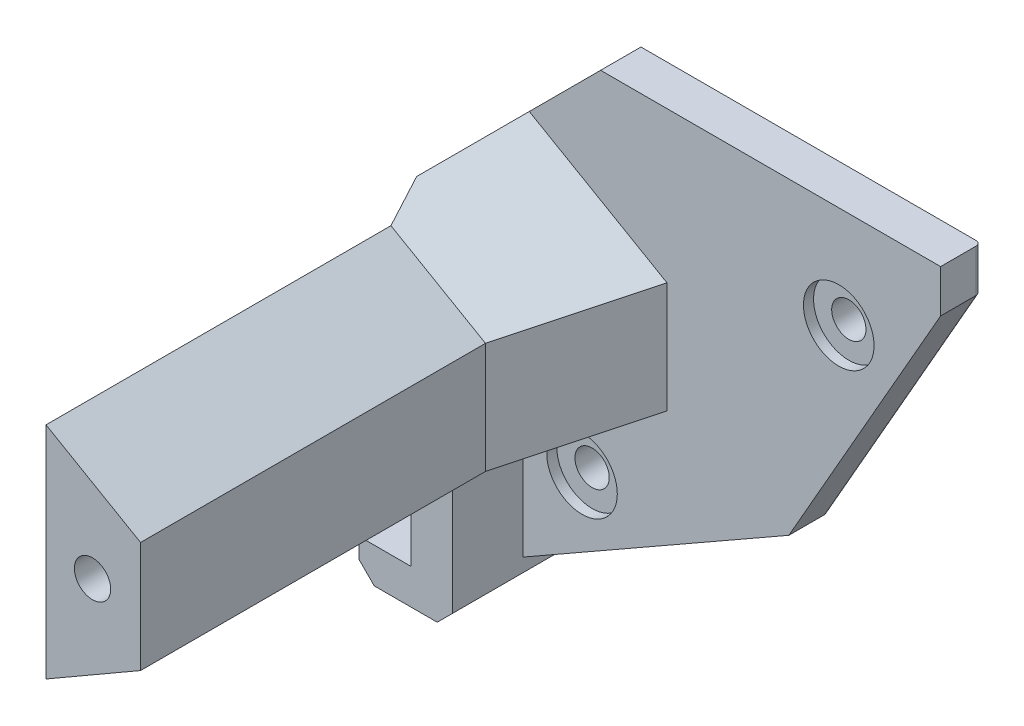
ISO-10303-21;
HEADER;
FILE_DESCRIPTION(('STEP AP214'),'2;1');
FILE_NAME('part.step','',(''),(''),'','','');
FILE_SCHEMA(('AUTOMOTIVE_DESIGN { 1 0 10303 214 1 1 1 1 }'));
ENDSEC;
DATA;
#1=APPLICATION_CONTEXT('core data for automotive mechanical design processes');
#2=APPLICATION_PROTOCOL_DEFINITION('international standard','automotive_design',2000,#1);
#3=PRODUCT_CONTEXT('',#1,'mechanical');
#4=PRODUCT('Part','Part','',(#3));
#5=PRODUCT_RELATED_PRODUCT_CATEGORY('part','',(#4));
#6=PRODUCT_DEFINITION_FORMATION('','',#4);
#7=PRODUCT_DEFINITION_CONTEXT('part definition',#1,'design');
#8=PRODUCT_DEFINITION('design','',#6,#7);
#9=PRODUCT_DEFINITION_SHAPE('','',#8);
#10=(LENGTH_UNIT() NAMED_UNIT(*) SI_UNIT(.MILLI.,.METRE.));
#11=(NAMED_UNIT(*) PLANE_ANGLE_UNIT() SI_UNIT($,.RADIAN.));
#12=(NAMED_UNIT(*) SI_UNIT($,.STERADIAN.) SOLID_ANGLE_UNIT());
#13=UNCERTAINTY_MEASURE_WITH_UNIT(LENGTH_MEASURE(1.E-05),#10,'distance_accuracy_value','');
#14=(GEOMETRIC_REPRESENTATION_CONTEXT(3) GLOBAL_UNCERTAINTY_ASSIGNED_CONTEXT((#13)) GLOBAL_UNIT_ASSIGNED_CONTEXT((#10,
#11,#12)) REPRESENTATION_CONTEXT('',''));
#15=CARTESIAN_POINT('',(0.,0.,0.));
#16=DIRECTION('',(0.,0.,1.));
#17=DIRECTION('',(1.,0.,0.));
#18=AXIS2_PLACEMENT_3D('',#15,#16,#17);
#19=CARTESIAN_POINT('',(35.1478751443918,-60.6037192671102,4.));
#20=DIRECTION('',(0.,0.,-1.));
#21=DIRECTION('',(-1.,0.,0.));
#22=AXIS2_PLACEMENT_3D('',#19,#20,#21);
#23=CYLINDRICAL_SURFACE('',#22,1.70000000000199);
#24=CARTESIAN_POINT('',(35.1478751443918,-60.6037192671102,0.));
#25=DIRECTION('',(0.,0.,1.));
#26=DIRECTION('',(1.,0.,0.));
#27=AXIS2_PLACEMENT_3D('',#24,#25,#26);
#28=CIRCLE('',#27,1.70000000000199);
#29=CARTESIAN_POINT('',(36.8478751443938,-60.6037192671102,0.));
#30=VERTEX_POINT('',#29);
#31=EDGE_CURVE('E208',#30,#30,#28,.T.);
#32=ORIENTED_EDGE('',*,*,#31,.F.);
#33=EDGE_LOOP('',(#32));
#34=FACE_BOUND('',#33,.T.);
#35=CARTESIAN_POINT('',(35.1478751443918,-60.6037192671102,3.));
#36=DIRECTION('',(0.,0.,1.));
#37=DIRECTION('',(1.,0.,0.));
#38=AXIS2_PLACEMENT_3D('',#35,#36,#37);
#39=CIRCLE('',#38,1.70000000000199);
#40=CARTESIAN_POINT('',(36.8478751443938,-60.6037192671102,3.));
#41=VERTEX_POINT('',#40);
#42=EDGE_CURVE('E262',#41,#41,#39,.T.);
#43=ORIENTED_EDGE('',*,*,#42,.T.);
#44=EDGE_LOOP('',(#43));
#45=FACE_BOUND('',#44,.T.);
#46=ADVANCED_FACE('F38',(#34,#45),#23,.F.);
#47=CARTESIAN_POINT('',(60.6037192671076,-35.1478751443945,4.));
#48=DIRECTION('',(0.,0.,-1.));
#49=DIRECTION('',(-1.,0.,0.));
#50=AXIS2_PLACEMENT_3D('',#47,#48,#49);
#51=CYLINDRICAL_SURFACE('',#50,1.70000000000218);
#52=CARTESIAN_POINT('',(60.6037192671076,-35.1478751443945,0.));
#53=DIRECTION('',(0.,0.,1.));
#54=DIRECTION('',(1.,0.,0.));
#55=AXIS2_PLACEMENT_3D('',#52,#53,#54);
#56=CIRCLE('',#55,1.70000000000218);
#57=CARTESIAN_POINT('',(62.3037192671097,-35.1478751443945,0.));
#58=VERTEX_POINT('',#57);
#59=EDGE_CURVE('E294',#58,#58,#56,.T.);
#60=ORIENTED_EDGE('',*,*,#59,.F.);
#61=EDGE_LOOP('',(#60));
#62=FACE_BOUND('',#61,.T.);
#63=CARTESIAN_POINT('',(60.6037192671076,-35.1478751443945,3.));
#64=DIRECTION('',(0.,0.,1.));
#65=DIRECTION('',(1.,0.,0.));
#66=AXIS2_PLACEMENT_3D('',#63,#64,#65);
#67=CIRCLE('',#66,1.70000000000218);
#68=CARTESIAN_POINT('',(62.3037192671097,-35.1478751443945,3.));
#69=VERTEX_POINT('',#68);
#70=EDGE_CURVE('E259',#69,#69,#67,.T.);
#71=ORIENTED_EDGE('',*,*,#70,.T.);
#72=EDGE_LOOP('',(#71));
#73=FACE_BOUND('',#72,.T.);
#74=ADVANCED_FACE('F321',(#62,#73),#51,.F.);
#75=CARTESIAN_POINT('',(31.021837567298,-31.0218375672957,4.));
#76=DIRECTION('',(-0.707106781186574,0.707106781186521,0.));
#77=DIRECTION('',(-0.707106781186521,-0.707106781186574,0.));
#78=AXIS2_PLACEMENT_3D('',#75,#76,#77);
#79=PLANE('',#78);
#80=DIRECTION('',(0.707106781186521,0.707106781186574,0.));
#81=VECTOR('',#80,1.);
#82=CARTESIAN_POINT('',(31.021837567298,-31.0218375672957,0.));
#83=LINE('',#82,#81);
#84=CARTESIAN_POINT('',(25.2,-36.8436751345942,0.));
#85=VERTEX_POINT('',#84);
#86=CARTESIAN_POINT('',(36.9936751345955,-25.0499999999978,0.));
#87=VERTEX_POINT('',#86);
#88=EDGE_CURVE('E191',#85,#87,#83,.T.);
#89=ORIENTED_EDGE('',*,*,#88,.F.);
#90=DIRECTION('',(0.,0.,-1.));
#91=VECTOR('',#90,1.);
#92=CARTESIAN_POINT('',(25.2,-36.8436751345942,80.4066636545569));
#93=LINE('',#92,#91);
#94=CARTESIAN_POINT('',(25.2,-36.8436751345942,10.447019978079));
#95=VERTEX_POINT('',#94);
#96=EDGE_CURVE('E54',#95,#85,#93,.T.);
#97=ORIENTED_EDGE('',*,*,#96,.F.);
#98=DIRECTION('',(0.508589802709456,0.508589802709494,-0.694746590606873));
#99=VECTOR('',#98,1.);
#100=CARTESIAN_POINT('',(24.5604591975379,-37.4832159370563,11.320648960999));
#101=LINE('',#100,#99);
#102=CARTESIAN_POINT('',(29.9195461813652,-32.1241289532286,4.));
#103=VERTEX_POINT('',#102);
#104=EDGE_CURVE('E11',#95,#103,#101,.T.);
#105=ORIENTED_EDGE('',*,*,#104,.T.);
#106=DIRECTION('',(0.707106781186521,0.707106781186574,0.));
#107=VECTOR('',#106,1.);
#108=CARTESIAN_POINT('',(31.021837567298,-31.0218375672957,4.));
#109=LINE('',#108,#107);
#110=CARTESIAN_POINT('',(36.9936751345955,-25.0499999999978,4.));
#111=VERTEX_POINT('',#110);
#112=EDGE_CURVE('E214',#103,#111,#109,.T.);
#113=ORIENTED_EDGE('',*,*,#112,.T.);
#114=DIRECTION('',(0.,0.,-1.));
#115=VECTOR('',#114,1.);
#116=CARTESIAN_POINT('',(36.9936751345955,-25.0499999999978,4.));
#117=LINE('',#116,#115);
#118=EDGE_CURVE('E201',#111,#87,#117,.T.);
#119=ORIENTED_EDGE('',*,*,#118,.T.);
#120=EDGE_LOOP('',(#89,#97,#105,#113,#119));
#121=FACE_BOUND('',#120,.T.);
#122=ADVANCED_FACE('F199',(#121),#79,.T.);
#123=CARTESIAN_POINT('',(0.,0.,4.));
#124=DIRECTION('',(0.,0.,1.));
#125=DIRECTION('',(1.,0.,0.));
#126=AXIS2_PLACEMENT_3D('',#123,#124,#125);
#127=PLANE('',#126);
#128=CARTESIAN_POINT('',(60.6037192671076,-35.1478751443945,4.));
#129=DIRECTION('',(0.,0.,1.));
#130=DIRECTION('',(1.,0.,0.));
#131=AXIS2_PLACEMENT_3D('',#128,#129,#130);
#132=CIRCLE('',#131,3.50000000000001);
#133=CARTESIAN_POINT('',(64.1037192671076,-35.1478751443945,4.));
#134=VERTEX_POINT('',#133);
#135=EDGE_CURVE('E334',#134,#134,#132,.T.);
#136=ORIENTED_EDGE('',*,*,#135,.F.);
#137=EDGE_LOOP('',(#136));
#138=FACE_BOUND('',#137,.T.);
#139=CARTESIAN_POINT('',(35.1478751443918,-60.6037192671102,4.));
#140=DIRECTION('',(0.,0.,1.));
#141=DIRECTION('',(1.,0.,0.));
#142=AXIS2_PLACEMENT_3D('',#139,#140,#141);
#143=CIRCLE('',#142,3.5);
#144=CARTESIAN_POINT('',(38.6478751443919,-60.6037192671102,4.));
#145=VERTEX_POINT('',#144);
#146=EDGE_CURVE('E301',#145,#145,#143,.T.);
#147=ORIENTED_EDGE('',*,*,#146,.F.);
#148=EDGE_LOOP('',(#147));
#149=FACE_BOUND('',#148,.T.);
#150=DIRECTION('',(0.,-1.,0.));
#151=VECTOR('',#150,1.);
#152=CARTESIAN_POINT('',(43.5762794416288,0.,4.));
#153=LINE('',#152,#151);
#154=CARTESIAN_POINT('',(43.5762794416288,-40.0088475772927,4.));
#155=VERTEX_POINT('',#154);
#156=CARTESIAN_POINT('',(43.5762794416288,-51.0088475772927,4.));
#157=VERTEX_POINT('',#156);
#158=EDGE_CURVE('E270',#155,#157,#153,.T.);
#159=ORIENTED_EDGE('',*,*,#158,.T.);
#160=DIRECTION('',(0.866025403784439,0.5,0.));
#161=VECTOR('',#160,1.);
#162=CARTESIAN_POINT('',(25.05,-61.7049999999994,4.));
#163=LINE('',#162,#161);
#164=CARTESIAN_POINT('',(29.2892350986244,-59.2574764746505,4.));
#165=VERTEX_POINT('',#164);
#166=EDGE_CURVE('E286',#165,#157,#163,.T.);
#167=ORIENTED_EDGE('',*,*,#166,.F.);
#168=DIRECTION('',(0.,1.,0.));
#169=VECTOR('',#168,1.);
#170=CARTESIAN_POINT('',(29.2892350986243,0.,4.));
#171=LINE('',#170,#169);
#172=CARTESIAN_POINT('',(29.2892350986244,-70.7049999999994,4.));
#173=VERTEX_POINT('',#172);
#174=EDGE_CURVE('E385',#173,#165,#171,.T.);
#175=ORIENTED_EDGE('',*,*,#174,.F.);
#176=DIRECTION('',(-0.868449319732085,-0.495777953379212,0.));
#177=VECTOR('',#176,1.);
#178=CARTESIAN_POINT('',(37.6417756121471,-65.9367246991577,4.));
#179=LINE('',#178,#177);
#180=CARTESIAN_POINT('',(55.653971798805,-55.6539717988031,4.));
#181=VERTEX_POINT('',#180);
#182=EDGE_CURVE('E202',#181,#173,#179,.T.);
#183=ORIENTED_EDGE('',*,*,#182,.F.);
#184=DIRECTION('',(-0.495777953379193,-0.868449319732095,0.));
#185=VECTOR('',#184,1.);
#186=CARTESIAN_POINT('',(65.9367246991587,-37.6417756121458,4.));
#187=LINE('',#186,#185);
#188=CARTESIAN_POINT('',(70.7050000000007,-29.2892350986222,4.));
#189=VERTEX_POINT('',#188);
#190=EDGE_CURVE('E206',#189,#181,#187,.T.);
#191=ORIENTED_EDGE('',*,*,#190,.F.);
#192=DIRECTION('',(0.,1.,0.));
#193=VECTOR('',#192,1.);
#194=CARTESIAN_POINT('',(70.7050000000007,0.,4.));
#195=LINE('',#194,#193);
#196=CARTESIAN_POINT('',(70.7050000000007,-25.0499999999978,4.));
#197=VERTEX_POINT('',#196);
#198=EDGE_CURVE('E309',#189,#197,#195,.T.);
#199=ORIENTED_EDGE('',*,*,#198,.T.);
#200=DIRECTION('',(-1.,0.,0.));
#201=VECTOR('',#200,1.);
#202=CARTESIAN_POINT('',(0.,-25.0499999999978,4.));
#203=LINE('',#202,#201);
#204=EDGE_CURVE('E307',#197,#111,#203,.T.);
#205=ORIENTED_EDGE('',*,*,#204,.T.);
#206=ORIENTED_EDGE('',*,*,#112,.F.);
#207=DIRECTION('',(0.866025403784439,-0.499999999999999,0.));
#208=VECTOR('',#207,1.);
#209=CARTESIAN_POINT('',(-6.43026932863032,-11.1375531835396,4.));
#210=LINE('',#209,#208);
#211=EDGE_CURVE('E268',#103,#155,#210,.T.);
#212=ORIENTED_EDGE('',*,*,#211,.T.);
#213=EDGE_LOOP('',(#159,#167,#175,#183,#191,#199,#205,#206,#212));
#214=FACE_BOUND('',#213,.T.);
#215=ADVANCED_FACE('F305',(#138,#149,#214),#127,.T.);
#216=CARTESIAN_POINT('',(0.,0.,0.));
#217=DIRECTION('',(0.,0.,1.));
#218=DIRECTION('',(1.,0.,0.));
#219=AXIS2_PLACEMENT_3D('',#216,#217,#218);
#220=PLANE('',#219);
#221=ORIENTED_EDGE('',*,*,#31,.T.);
#222=EDGE_LOOP('',(#221));
#223=FACE_BOUND('',#222,.T.);
#224=ORIENTED_EDGE('',*,*,#59,.T.);
#225=EDGE_LOOP('',(#224));
#226=FACE_BOUND('',#225,.T.);
#227=DIRECTION('',(1.,0.,0.));
#228=VECTOR('',#227,1.);
#229=CARTESIAN_POINT('',(25.05,-70.05,0.));
#230=LINE('',#229,#228);
#231=CARTESIAN_POINT('',(20.05,-70.05,0.));
#232=VERTEX_POINT('',#231);
#233=CARTESIAN_POINT('',(25.2,-70.05,0.));
#234=VERTEX_POINT('',#233);
#235=EDGE_CURVE('E194',#232,#234,#230,.T.);
#236=ORIENTED_EDGE('',*,*,#235,.T.);
#237=DIRECTION('',(0.,1.,0.));
#238=VECTOR('',#237,1.);
#239=CARTESIAN_POINT('',(25.2,-70.05,0.));
#240=LINE('',#239,#238);
#241=EDGE_CURVE('E183',#234,#85,#240,.T.);
#242=ORIENTED_EDGE('',*,*,#241,.T.);
#243=ORIENTED_EDGE('',*,*,#88,.T.);
#244=DIRECTION('',(-1.,0.,0.));
#245=VECTOR('',#244,1.);
#246=CARTESIAN_POINT('',(0.,-25.0499999999978,0.));
#247=LINE('',#246,#245);
#248=CARTESIAN_POINT('',(70.2050000000007,-25.0499999999978,0.));
#249=VERTEX_POINT('',#248);
#250=EDGE_CURVE('E203',#249,#87,#247,.T.);
#251=ORIENTED_EDGE('',*,*,#250,.F.);
#252=DIRECTION('',(0.,1.,0.));
#253=VECTOR('',#252,1.);
#254=CARTESIAN_POINT('',(70.2050000000007,0.,0.));
#255=LINE('',#254,#253);
#256=CARTESIAN_POINT('',(70.2050000000007,-29.1565641323446,0.));
#257=VERTEX_POINT('',#256);
#258=EDGE_CURVE('E239',#249,#257,#255,.F.);
#259=ORIENTED_EDGE('',*,*,#258,.T.);
#260=DIRECTION('',(-0.495777953379193,-0.868449319732095,0.));
#261=VECTOR('',#260,1.);
#262=CARTESIAN_POINT('',(55.219747138939,-55.4060828221135,0.));
#263=LINE('',#262,#261);
#264=CARTESIAN_POINT('',(55.2874639523084,-55.2874639523064,0.));
#265=VERTEX_POINT('',#264);
#266=EDGE_CURVE('E237',#257,#265,#263,.T.);
#267=ORIENTED_EDGE('',*,*,#266,.T.);
#268=DIRECTION('',(-0.868449319732085,-0.495777953379212,0.));
#269=VECTOR('',#268,1.);
#270=CARTESIAN_POINT('',(29.0413461219348,-70.2707753401333,0.));
#271=LINE('',#270,#269);
#272=CARTESIAN_POINT('',(29.2892350986244,-70.1292611645377,0.));
#273=VERTEX_POINT('',#272);
#274=EDGE_CURVE('E234',#265,#273,#271,.T.);
#275=ORIENTED_EDGE('',*,*,#274,.T.);
#276=DIRECTION('',(0.,-1.,0.));
#277=VECTOR('',#276,1.);
#278=CARTESIAN_POINT('',(29.2892350986244,-59.2574764746505,0.));
#279=LINE('',#278,#277);
#280=CARTESIAN_POINT('',(29.2892350986244,-72.05,0.));
#281=VERTEX_POINT('',#280);
#282=EDGE_CURVE('E383',#273,#281,#279,.T.);
#283=ORIENTED_EDGE('',*,*,#282,.T.);
#284=DIRECTION('',(-0.707106781186541,-0.707106781186554,0.));
#285=VECTOR('',#284,1.);
#286=CARTESIAN_POINT('',(29.2892350986244,-72.05,0.));
#287=LINE('',#286,#285);
#288=CARTESIAN_POINT('',(27.7892350986244,-73.55,0.));
#289=VERTEX_POINT('',#288);
#290=EDGE_CURVE('E381',#281,#289,#287,.T.);
#291=ORIENTED_EDGE('',*,*,#290,.T.);
#292=DIRECTION('',(-1.,0.,0.));
#293=VECTOR('',#292,1.);
#294=CARTESIAN_POINT('',(27.7892350986244,-73.55,0.));
#295=LINE('',#294,#293);
#296=CARTESIAN_POINT('',(21.55,-73.55,0.));
#297=VERTEX_POINT('',#296);
#298=EDGE_CURVE('E379',#289,#297,#295,.T.);
#299=ORIENTED_EDGE('',*,*,#298,.T.);
#300=DIRECTION('',(-0.707106781186554,0.707106781186541,0.));
#301=VECTOR('',#300,1.);
#302=CARTESIAN_POINT('',(20.05,-72.05,0.));
#303=LINE('',#302,#301);
#304=CARTESIAN_POINT('',(20.05,-72.05,0.));
#305=VERTEX_POINT('',#304);
#306=EDGE_CURVE('E377',#297,#305,#303,.T.);
#307=ORIENTED_EDGE('',*,*,#306,.T.);
#308=DIRECTION('',(0.,1.,0.));
#309=VECTOR('',#308,1.);
#310=CARTESIAN_POINT('',(20.05,-70.05,0.));
#311=LINE('',#310,#309);
#312=EDGE_CURVE('E374',#305,#232,#311,.T.);
#313=ORIENTED_EDGE('',*,*,#312,.T.);
#314=EDGE_LOOP('',(#236,#242,#243,#251,#259,#267,#275,#283,#291,#299,#307,#313));
#315=FACE_BOUND('',#314,.T.);
#316=ADVANCED_FACE('F189',(#223,#226,#315),#220,.F.);
#317=CARTESIAN_POINT('',(25.05,-61.7049999999994,47.2));
#318=DIRECTION('',(-0.5,0.866025403784439,0.));
#319=DIRECTION('',(-0.866025403784439,-0.5,0.));
#320=AXIS2_PLACEMENT_3D('',#317,#318,#319);
#321=PLANE('',#320);
#322=DIRECTION('',(0.,0.,1.));
#323=VECTOR('',#322,1.);
#324=CARTESIAN_POINT('',(25.2,-61.6183974596209,47.2));
#325=LINE('',#324,#323);
#326=CARTESIAN_POINT('',(25.2,-61.6183974596209,11.));
#327=VERTEX_POINT('',#326);
#328=CARTESIAN_POINT('',(25.2,-61.6183974596209,47.2));
#329=VERTEX_POINT('',#328);
#330=EDGE_CURVE('E343',#327,#329,#325,.T.);
#331=ORIENTED_EDGE('',*,*,#330,.F.);
#332=DIRECTION('',(-0.866025403784438,-0.5,0.));
#333=VECTOR('',#332,1.);
#334=CARTESIAN_POINT('',(29.2892350986244,-59.2574764746505,11.));
#335=LINE('',#334,#333);
#336=CARTESIAN_POINT('',(29.2892350986244,-59.2574764746505,11.));
#337=VERTEX_POINT('',#336);
#338=EDGE_CURVE('E350',#337,#327,#335,.T.);
#339=ORIENTED_EDGE('',*,*,#338,.F.);
#340=DIRECTION('',(0.,0.,-1.));
#341=VECTOR('',#340,1.);
#342=CARTESIAN_POINT('',(29.2892350986244,-59.2574764746505,47.2));
#343=LINE('',#342,#341);
#344=EDGE_CURVE('E226',#337,#165,#343,.T.);
#345=ORIENTED_EDGE('',*,*,#344,.T.);
#346=ORIENTED_EDGE('',*,*,#166,.T.);
#347=DIRECTION('',(-0.654653670707974,-0.377964473009225,0.654653670707981));
#348=VECTOR('',#347,1.);
#349=CARTESIAN_POINT('',(14.4755483321267,-67.8101625169787,33.1007311095024));
#350=LINE('',#349,#348);
#351=CARTESIAN_POINT('',(34.5762794416288,-56.2049999999993,13.0000000000001));
#352=VERTEX_POINT('',#351);
#353=EDGE_CURVE('E274',#157,#352,#350,.T.);
#354=ORIENTED_EDGE('',*,*,#353,.T.);
#355=DIRECTION('',(0.,0.,-1.));
#356=VECTOR('',#355,1.);
#357=CARTESIAN_POINT('',(34.5762794416288,-56.2049999999993,47.2));
#358=LINE('',#357,#356);
#359=CARTESIAN_POINT('',(34.5762794416288,-56.2049999999993,47.2));
#360=VERTEX_POINT('',#359);
#361=EDGE_CURVE('E283',#360,#352,#358,.T.);
#362=ORIENTED_EDGE('',*,*,#361,.F.);
#363=DIRECTION('',(0.866025403784439,0.5,0.));
#364=VECTOR('',#363,1.);
#365=CARTESIAN_POINT('',(25.05,-61.7049999999994,47.2));
#366=LINE('',#365,#364);
#367=EDGE_CURVE('E395',#329,#360,#366,.T.);
#368=ORIENTED_EDGE('',*,*,#367,.F.);
#369=EDGE_LOOP('',(#331,#339,#345,#346,#354,#362,#368));
#370=FACE_BOUND('',#369,.T.);
#371=ADVANCED_FACE('F281',(#370),#321,.F.);
#372=CARTESIAN_POINT('',(34.5762794416288,-45.2049999999993,47.2));
#373=DIRECTION('',(-0.499999999999999,-0.866025403784439,0.));
#374=DIRECTION('',(0.866025403784439,-0.499999999999999,0.));
#375=AXIS2_PLACEMENT_3D('',#372,#373,#374);
#376=PLANE('',#375);
#377=DIRECTION('',(0.,0.,-1.));
#378=VECTOR('',#377,1.);
#379=CARTESIAN_POINT('',(34.5762794416288,-45.2049999999993,47.2));
#380=LINE('',#379,#378);
#381=CARTESIAN_POINT('',(34.5762794416288,-45.2049999999993,47.2));
#382=VERTEX_POINT('',#381);
#383=CARTESIAN_POINT('',(34.5762794416288,-45.2049999999993,13.0000000000001));
#384=VERTEX_POINT('',#383);
#385=EDGE_CURVE('E295',#382,#384,#380,.T.);
#386=ORIENTED_EDGE('',*,*,#385,.T.);
#387=DIRECTION('',(-0.866025403784439,0.499999999999999,0.));
#388=VECTOR('',#387,1.);
#389=CARTESIAN_POINT('',(34.5762794416288,-45.2049999999993,13.0000000000001));
#390=LINE('',#389,#388);
#391=CARTESIAN_POINT('',(25.2,-39.7916025403778,13.0000000000001));
#392=VERTEX_POINT('',#391);
#393=EDGE_CURVE('E62',#384,#392,#390,.T.);
#394=ORIENTED_EDGE('',*,*,#393,.T.);
#395=DIRECTION('',(0.,0.,-1.));
#396=VECTOR('',#395,1.);
#397=CARTESIAN_POINT('',(25.2,-39.7916025403778,47.2));
#398=LINE('',#397,#396);
#399=CARTESIAN_POINT('',(25.2,-39.7916025403778,47.2));
#400=VERTEX_POINT('',#399);
#401=EDGE_CURVE('E252',#400,#392,#398,.T.);
#402=ORIENTED_EDGE('',*,*,#401,.F.);
#403=DIRECTION('',(-0.866025403784439,0.499999999999999,0.));
#404=VECTOR('',#403,1.);
#405=CARTESIAN_POINT('',(34.5762794416288,-45.2049999999993,47.2));
#406=LINE('',#405,#404);
#407=EDGE_CURVE('E398',#382,#400,#406,.T.);
#408=ORIENTED_EDGE('',*,*,#407,.F.);
#409=EDGE_LOOP('',(#386,#394,#402,#408));
#410=FACE_BOUND('',#409,.T.);
#411=ADVANCED_FACE('F591',(#410),#376,.F.);
#412=CARTESIAN_POINT('',(0.,0.,47.2));
#413=DIRECTION('',(0.,0.,1.));
#414=DIRECTION('',(1.,0.,0.));
#415=AXIS2_PLACEMENT_3D('',#412,#413,#414);
#416=PLANE('',#415);
#417=CARTESIAN_POINT('',(29.8131397208144,-50.7049999999993,47.2));
#418=DIRECTION('',(0.,0.,1.));
#419=DIRECTION('',(1.,0.,0.));
#420=AXIS2_PLACEMENT_3D('',#417,#418,#419);
#421=CIRCLE('',#420,1.8);
#422=CARTESIAN_POINT('',(31.6131397208144,-50.7049999999993,47.2));
#423=VERTEX_POINT('',#422);
#424=EDGE_CURVE('E255',#423,#423,#421,.T.);
#425=ORIENTED_EDGE('',*,*,#424,.F.);
#426=EDGE_LOOP('',(#425));
#427=FACE_BOUND('',#426,.T.);
#428=ORIENTED_EDGE('',*,*,#407,.T.);
#429=DIRECTION('',(0.,1.,0.));
#430=VECTOR('',#429,1.);
#431=CARTESIAN_POINT('',(25.2,-70.05,47.2));
#432=LINE('',#431,#430);
#433=EDGE_CURVE('E186',#329,#400,#432,.T.);
#434=ORIENTED_EDGE('',*,*,#433,.F.);
#435=ORIENTED_EDGE('',*,*,#367,.T.);
#436=DIRECTION('',(0.,1.,0.));
#437=VECTOR('',#436,1.);
#438=CARTESIAN_POINT('',(34.5762794416288,-56.2049999999993,47.2));
#439=LINE('',#438,#437);
#440=EDGE_CURVE('E293',#360,#382,#439,.T.);
#441=ORIENTED_EDGE('',*,*,#440,.T.);
#442=EDGE_LOOP('',(#428,#434,#435,#441));
#443=FACE_BOUND('',#442,.T.);
#444=ADVANCED_FACE('F598',(#427,#443),#416,.T.);
#445=CARTESIAN_POINT('',(0.,0.,11.));
#446=DIRECTION('',(0.,0.,1.));
#447=DIRECTION('',(1.,0.,0.));
#448=AXIS2_PLACEMENT_3D('',#445,#446,#447);
#449=PLANE('',#448);
#450=DIRECTION('',(0.,-1.,0.));
#451=VECTOR('',#450,1.);
#452=CARTESIAN_POINT('',(25.2,0.,11.));
#453=LINE('',#452,#451);
#454=CARTESIAN_POINT('',(25.2,-70.05,11.));
#455=VERTEX_POINT('',#454);
#456=EDGE_CURVE('E247',#327,#455,#453,.T.);
#457=ORIENTED_EDGE('',*,*,#456,.T.);
#458=DIRECTION('',(-1.,0.,0.));
#459=VECTOR('',#458,1.);
#460=CARTESIAN_POINT('',(25.05,-70.05,11.));
#461=LINE('',#460,#459);
#462=CARTESIAN_POINT('',(20.05,-70.05,11.));
#463=VERTEX_POINT('',#462);
#464=EDGE_CURVE('E355',#455,#463,#461,.T.);
#465=ORIENTED_EDGE('',*,*,#464,.T.);
#466=DIRECTION('',(0.,-1.,0.));
#467=VECTOR('',#466,1.);
#468=CARTESIAN_POINT('',(20.05,-70.05,11.));
#469=LINE('',#468,#467);
#470=CARTESIAN_POINT('',(20.05,-72.05,11.));
#471=VERTEX_POINT('',#470);
#472=EDGE_CURVE('E358',#463,#471,#469,.T.);
#473=ORIENTED_EDGE('',*,*,#472,.T.);
#474=DIRECTION('',(0.707106781186554,-0.707106781186541,0.));
#475=VECTOR('',#474,1.);
#476=CARTESIAN_POINT('',(20.05,-72.05,11.));
#477=LINE('',#476,#475);
#478=CARTESIAN_POINT('',(21.55,-73.55,11.));
#479=VERTEX_POINT('',#478);
#480=EDGE_CURVE('E361',#471,#479,#477,.T.);
#481=ORIENTED_EDGE('',*,*,#480,.T.);
#482=DIRECTION('',(1.,0.,0.));
#483=VECTOR('',#482,1.);
#484=CARTESIAN_POINT('',(27.7892350986244,-73.55,11.));
#485=LINE('',#484,#483);
#486=CARTESIAN_POINT('',(27.7892350986244,-73.55,11.));
#487=VERTEX_POINT('',#486);
#488=EDGE_CURVE('E364',#479,#487,#485,.T.);
#489=ORIENTED_EDGE('',*,*,#488,.T.);
#490=DIRECTION('',(0.707106781186541,0.707106781186554,0.));
#491=VECTOR('',#490,1.);
#492=CARTESIAN_POINT('',(29.2892350986244,-72.05,11.));
#493=LINE('',#492,#491);
#494=CARTESIAN_POINT('',(29.2892350986244,-72.05,11.));
#495=VERTEX_POINT('',#494);
#496=EDGE_CURVE('E367',#487,#495,#493,.T.);
#497=ORIENTED_EDGE('',*,*,#496,.T.);
#498=DIRECTION('',(0.,1.,0.));
#499=VECTOR('',#498,1.);
#500=CARTESIAN_POINT('',(29.2892350986244,-59.2574764746505,11.));
#501=LINE('',#500,#499);
#502=EDGE_CURVE('E370',#495,#337,#501,.T.);
#503=ORIENTED_EDGE('',*,*,#502,.T.);
#504=ORIENTED_EDGE('',*,*,#338,.T.);
#505=EDGE_LOOP('',(#457,#465,#473,#481,#489,#497,#503,#504));
#506=FACE_BOUND('',#505,.T.);
#507=ADVANCED_FACE('F442',(#506),#449,.T.);
#508=CARTESIAN_POINT('',(37.6417756121471,-65.9367246991577,4.));
#509=DIRECTION('',(0.495777953379212,-0.868449319732085,0.));
#510=DIRECTION('',(0.868449319732085,0.495777953379212,0.));
#511=AXIS2_PLACEMENT_3D('',#508,#509,#510);
#512=PLANE('',#511);
#513=DIRECTION('',(0.,0.,-1.));
#514=VECTOR('',#513,1.);
#515=CARTESIAN_POINT('',(29.2892350986244,-70.7049999999994,4.));
#516=LINE('',#515,#514);
#517=CARTESIAN_POINT('',(29.2892350986244,-70.7049999999994,0.5));
#518=VERTEX_POINT('',#517);
#519=EDGE_CURVE('E223',#173,#518,#516,.T.);
#520=ORIENTED_EDGE('',*,*,#519,.T.);
#521=DIRECTION('',(-0.868449319732085,-0.495777953379212,0.));
#522=VECTOR('',#521,1.);
#523=CARTESIAN_POINT('',(55.653971798805,-55.6539717988031,0.5));
#524=LINE('',#523,#522);
#525=CARTESIAN_POINT('',(55.653971798805,-55.6539717988031,0.5));
#526=VERTEX_POINT('',#525);
#527=EDGE_CURVE('E243',#518,#526,#524,.F.);
#528=ORIENTED_EDGE('',*,*,#527,.T.);
#529=DIRECTION('',(0.,0.,-1.));
#530=VECTOR('',#529,1.);
#531=CARTESIAN_POINT('',(55.653971798805,-55.6539717988031,4.));
#532=LINE('',#531,#530);
#533=EDGE_CURVE('E220',#181,#526,#532,.T.);
#534=ORIENTED_EDGE('',*,*,#533,.F.);
#535=ORIENTED_EDGE('',*,*,#182,.T.);
#536=EDGE_LOOP('',(#520,#528,#534,#535));
#537=FACE_BOUND('',#536,.T.);
#538=ADVANCED_FACE('F432',(#537),#512,.T.);
#539=CARTESIAN_POINT('',(65.9367246991587,-37.6417756121458,4.));
#540=DIRECTION('',(0.868449319732095,-0.495777953379193,0.));
#541=DIRECTION('',(0.495777953379193,0.868449319732095,0.));
#542=AXIS2_PLACEMENT_3D('',#539,#540,#541);
#543=PLANE('',#542);
#544=ORIENTED_EDGE('',*,*,#533,.T.);
#545=DIRECTION('',(-0.495777953379193,-0.868449319732095,0.));
#546=VECTOR('',#545,1.);
#547=CARTESIAN_POINT('',(70.7050000000007,-29.2892350986222,0.5));
#548=LINE('',#547,#546);
#549=CARTESIAN_POINT('',(70.7050000000007,-29.2892350986222,0.5));
#550=VERTEX_POINT('',#549);
#551=EDGE_CURVE('E241',#526,#550,#548,.F.);
#552=ORIENTED_EDGE('',*,*,#551,.T.);
#553=DIRECTION('',(0.,0.,-1.));
#554=VECTOR('',#553,1.);
#555=CARTESIAN_POINT('',(70.7050000000007,-29.2892350986222,4.));
#556=LINE('',#555,#554);
#557=EDGE_CURVE('E217',#189,#550,#556,.T.);
#558=ORIENTED_EDGE('',*,*,#557,.F.);
#559=ORIENTED_EDGE('',*,*,#190,.T.);
#560=EDGE_LOOP('',(#544,#552,#558,#559));
#561=FACE_BOUND('',#560,.T.);
#562=ADVANCED_FACE('F434',(#561),#543,.T.);
#563=CARTESIAN_POINT('',(70.7050000000007,0.,4.));
#564=DIRECTION('',(-1.,0.,0.));
#565=DIRECTION('',(0.,0.,1.));
#566=AXIS2_PLACEMENT_3D('',#563,#564,#565);
#567=PLANE('',#566);
#568=ORIENTED_EDGE('',*,*,#557,.T.);
#569=DIRECTION('',(0.,1.,0.));
#570=VECTOR('',#569,1.);
#571=CARTESIAN_POINT('',(70.7050000000007,0.,0.5));
#572=LINE('',#571,#570);
#573=CARTESIAN_POINT('',(70.7050000000007,-25.0499999999978,0.5));
#574=VERTEX_POINT('',#573);
#575=EDGE_CURVE('E229',#550,#574,#572,.T.);
#576=ORIENTED_EDGE('',*,*,#575,.T.);
#577=DIRECTION('',(0.,0.,-1.));
#578=VECTOR('',#577,1.);
#579=CARTESIAN_POINT('',(70.7050000000007,-25.0499999999978,4.));
#580=LINE('',#579,#578);
#581=EDGE_CURVE('E213',#197,#574,#580,.T.);
#582=ORIENTED_EDGE('',*,*,#581,.F.);
#583=ORIENTED_EDGE('',*,*,#198,.F.);
#584=EDGE_LOOP('',(#568,#576,#582,#583));
#585=FACE_BOUND('',#584,.T.);
#586=ADVANCED_FACE('F409',(#585),#567,.F.);
#587=CARTESIAN_POINT('',(0.,-25.0499999999978,4.));
#588=DIRECTION('',(0.,-1.,0.));
#589=DIRECTION('',(1.,0.,0.));
#590=AXIS2_PLACEMENT_3D('',#587,#588,#589);
#591=PLANE('',#590);
#592=ORIENTED_EDGE('',*,*,#581,.T.);
#593=CARTESIAN_POINT('',(70.2050000000007,-25.0499999999978,0.5));
#594=DIRECTION('',(0.,-1.,0.));
#595=DIRECTION('',(1.,0.,0.));
#596=AXIS2_PLACEMENT_3D('',#593,#594,#595);
#597=CIRCLE('',#596,0.5);
#598=EDGE_CURVE('E232',#574,#249,#597,.F.);
#599=ORIENTED_EDGE('',*,*,#598,.T.);
#600=ORIENTED_EDGE('',*,*,#250,.T.);
#601=ORIENTED_EDGE('',*,*,#118,.F.);
#602=ORIENTED_EDGE('',*,*,#204,.F.);
#603=EDGE_LOOP('',(#592,#599,#600,#601,#602));
#604=FACE_BOUND('',#603,.T.);
#605=ADVANCED_FACE('F412',(#604),#591,.F.);
#606=CARTESIAN_POINT('',(34.5762794416288,-56.2049999999993,47.2));
#607=DIRECTION('',(-1.,0.,0.));
#608=DIRECTION('',(0.,0.,1.));
#609=AXIS2_PLACEMENT_3D('',#606,#607,#608);
#610=PLANE('',#609);
#611=ORIENTED_EDGE('',*,*,#361,.T.);
#612=DIRECTION('',(0.,1.,0.));
#613=VECTOR('',#612,1.);
#614=CARTESIAN_POINT('',(34.5762794416288,-56.2049999999993,13.0000000000001));
#615=LINE('',#614,#613);
#616=EDGE_CURVE('E258',#352,#384,#615,.T.);
#617=ORIENTED_EDGE('',*,*,#616,.T.);
#618=ORIENTED_EDGE('',*,*,#385,.F.);
#619=ORIENTED_EDGE('',*,*,#440,.F.);
#620=EDGE_LOOP('',(#611,#617,#618,#619));
#621=FACE_BOUND('',#620,.T.);
#622=ADVANCED_FACE('F291',(#621),#610,.F.);
#623=CARTESIAN_POINT('',(29.2892350986244,-59.2574764746505,-17.0188041275033));
#624=DIRECTION('',(1.,0.,0.));
#625=DIRECTION('',(0.,1.,0.));
#626=AXIS2_PLACEMENT_3D('',#623,#624,#625);
#627=PLANE('',#626);
#628=ORIENTED_EDGE('',*,*,#282,.F.);
#629=CARTESIAN_POINT('',(29.2892350986244,-70.1292611645377,0.5));
#630=DIRECTION('',(1.,0.,0.));
#631=DIRECTION('',(0.,1.,0.));
#632=AXIS2_PLACEMENT_3D('',#629,#630,#631);
#633=ELLIPSE('',#632,0.575738835461636,0.5);
#634=EDGE_CURVE('E245',#273,#518,#633,.F.);
#635=ORIENTED_EDGE('',*,*,#634,.T.);
#636=ORIENTED_EDGE('',*,*,#519,.F.);
#637=ORIENTED_EDGE('',*,*,#174,.T.);
#638=ORIENTED_EDGE('',*,*,#344,.F.);
#639=ORIENTED_EDGE('',*,*,#502,.F.);
#640=DIRECTION('',(0.,0.,1.));
#641=VECTOR('',#640,1.);
#642=CARTESIAN_POINT('',(29.2892350986244,-72.05,-17.0188041275033));
#643=LINE('',#642,#641);
#644=EDGE_CURVE('E375',#281,#495,#643,.T.);
#645=ORIENTED_EDGE('',*,*,#644,.F.);
#646=EDGE_LOOP('',(#628,#635,#636,#637,#638,#639,#645));
#647=FACE_BOUND('',#646,.T.);
#648=ADVANCED_FACE('F428',(#647),#627,.T.);
#649=CARTESIAN_POINT('',(29.2892350986244,-72.05,-17.0188041275033));
#650=DIRECTION('',(0.707106781186554,-0.707106781186541,0.));
#651=DIRECTION('',(0.707106781186541,0.707106781186554,0.));
#652=AXIS2_PLACEMENT_3D('',#649,#650,#651);
#653=PLANE('',#652);
#654=ORIENTED_EDGE('',*,*,#290,.F.);
#655=ORIENTED_EDGE('',*,*,#644,.T.);
#656=ORIENTED_EDGE('',*,*,#496,.F.);
#657=DIRECTION('',(0.,0.,1.));
#658=VECTOR('',#657,1.);
#659=CARTESIAN_POINT('',(27.7892350986244,-73.55,-17.0188041275033));
#660=LINE('',#659,#658);
#661=EDGE_CURVE('E387',#289,#487,#660,.T.);
#662=ORIENTED_EDGE('',*,*,#661,.F.);
#663=EDGE_LOOP('',(#654,#655,#656,#662));
#664=FACE_BOUND('',#663,.T.);
#665=ADVANCED_FACE('F539',(#664),#653,.T.);
#666=CARTESIAN_POINT('',(27.7892350986244,-73.55,-17.0188041275033));
#667=DIRECTION('',(0.,-1.,0.));
#668=DIRECTION('',(0.,0.,-1.));
#669=AXIS2_PLACEMENT_3D('',#666,#667,#668);
#670=PLANE('',#669);
#671=ORIENTED_EDGE('',*,*,#298,.F.);
#672=ORIENTED_EDGE('',*,*,#661,.T.);
#673=ORIENTED_EDGE('',*,*,#488,.F.);
#674=DIRECTION('',(0.,0.,1.));
#675=VECTOR('',#674,1.);
#676=CARTESIAN_POINT('',(21.55,-73.55,-17.0188041275033));
#677=LINE('',#676,#675);
#678=EDGE_CURVE('E389',#297,#479,#677,.T.);
#679=ORIENTED_EDGE('',*,*,#678,.F.);
#680=EDGE_LOOP('',(#671,#672,#673,#679));
#681=FACE_BOUND('',#680,.T.);
#682=ADVANCED_FACE('F531',(#681),#670,.T.);
#683=CARTESIAN_POINT('',(20.05,-72.05,-17.0188041275033));
#684=DIRECTION('',(-0.707106781186541,-0.707106781186554,0.));
#685=DIRECTION('',(0.707106781186554,-0.707106781186541,0.));
#686=AXIS2_PLACEMENT_3D('',#683,#684,#685);
#687=PLANE('',#686);
#688=ORIENTED_EDGE('',*,*,#306,.F.);
#689=ORIENTED_EDGE('',*,*,#678,.T.);
#690=ORIENTED_EDGE('',*,*,#480,.F.);
#691=DIRECTION('',(0.,0.,1.));
#692=VECTOR('',#691,1.);
#693=CARTESIAN_POINT('',(20.05,-72.05,-17.0188041275033));
#694=LINE('',#693,#692);
#695=EDGE_CURVE('E391',#305,#471,#694,.T.);
#696=ORIENTED_EDGE('',*,*,#695,.F.);
#697=EDGE_LOOP('',(#688,#689,#690,#696));
#698=FACE_BOUND('',#697,.T.);
#699=ADVANCED_FACE('F523',(#698),#687,.T.);
#700=CARTESIAN_POINT('',(20.05,-70.05,-17.0188041275033));
#701=DIRECTION('',(-1.,0.,0.));
#702=DIRECTION('',(0.,0.,1.));
#703=AXIS2_PLACEMENT_3D('',#700,#701,#702);
#704=PLANE('',#703);
#705=ORIENTED_EDGE('',*,*,#312,.F.);
#706=ORIENTED_EDGE('',*,*,#695,.T.);
#707=ORIENTED_EDGE('',*,*,#472,.F.);
#708=DIRECTION('',(0.,0.,1.));
#709=VECTOR('',#708,1.);
#710=CARTESIAN_POINT('',(20.05,-70.05,-17.0188041275033));
#711=LINE('',#710,#709);
#712=EDGE_CURVE('E372',#232,#463,#711,.T.);
#713=ORIENTED_EDGE('',*,*,#712,.F.);
#714=EDGE_LOOP('',(#705,#706,#707,#713));
#715=FACE_BOUND('',#714,.T.);
#716=ADVANCED_FACE('F515',(#715),#704,.T.);
#717=CARTESIAN_POINT('',(25.05,-70.05,-17.0188041275033));
#718=DIRECTION('',(0.,1.,0.));
#719=DIRECTION('',(0.,0.,1.));
#720=AXIS2_PLACEMENT_3D('',#717,#718,#719);
#721=PLANE('',#720);
#722=ORIENTED_EDGE('',*,*,#235,.F.);
#723=ORIENTED_EDGE('',*,*,#712,.T.);
#724=ORIENTED_EDGE('',*,*,#464,.F.);
#725=DIRECTION('',(0.,0.,-1.));
#726=VECTOR('',#725,1.);
#727=CARTESIAN_POINT('',(25.2,-70.05,80.4066636545569));
#728=LINE('',#727,#726);
#729=EDGE_CURVE('E196',#455,#234,#728,.T.);
#730=ORIENTED_EDGE('',*,*,#729,.T.);
#731=EDGE_LOOP('',(#722,#723,#724,#730));
#732=FACE_BOUND('',#731,.T.);
#733=ADVANCED_FACE('F506',(#732),#721,.T.);
#734=CARTESIAN_POINT('',(29.8131397208144,-50.7049999999993,29.2));
#735=DIRECTION('',(0.,0.,1.));
#736=DIRECTION('',(1.,0.,0.));
#737=AXIS2_PLACEMENT_3D('',#734,#735,#736);
#738=CYLINDRICAL_SURFACE('',#737,1.8);
#739=CARTESIAN_POINT('',(29.8131397208144,-50.7049999999993,29.2));
#740=DIRECTION('',(0.,0.,1.));
#741=DIRECTION('',(1.,0.,0.));
#742=AXIS2_PLACEMENT_3D('',#739,#740,#741);
#743=CIRCLE('',#742,1.8);
#744=CARTESIAN_POINT('',(31.6131397208144,-50.7049999999993,29.2));
#745=VERTEX_POINT('',#744);
#746=EDGE_CURVE('E347',#745,#745,#743,.T.);
#747=ORIENTED_EDGE('',*,*,#746,.F.);
#748=EDGE_LOOP('',(#747));
#749=FACE_BOUND('',#748,.T.);
#750=ORIENTED_EDGE('',*,*,#424,.T.);
#751=EDGE_LOOP('',(#750));
#752=FACE_BOUND('',#751,.T.);
#753=ADVANCED_FACE('F498',(#749,#752),#738,.F.);
#754=CARTESIAN_POINT('',(29.8131397208144,-50.7049999999993,29.2));
#755=DIRECTION('',(0.,0.,1.));
#756=DIRECTION('',(1.,0.,0.));
#757=AXIS2_PLACEMENT_3D('',#754,#755,#756);
#758=PLANE('',#757);
#759=ORIENTED_EDGE('',*,*,#746,.T.);
#760=EDGE_LOOP('',(#759));
#761=FACE_BOUND('',#760,.T.);
#762=ADVANCED_FACE('F454',(#761),#758,.T.);
#763=CARTESIAN_POINT('',(37.3938866354575,-65.5025000392916,0.5));
#764=DIRECTION('',(0.868449319732085,0.495777953379212,0.));
#765=DIRECTION('',(-0.495777953379212,0.868449319732085,0.));
#766=AXIS2_PLACEMENT_3D('',#763,#764,#765);
#767=CYLINDRICAL_SURFACE('',#766,0.5);
#768=ORIENTED_EDGE('',*,*,#634,.F.);
#769=ORIENTED_EDGE('',*,*,#274,.F.);
#770=CARTESIAN_POINT('',(55.2874639523084,-55.2874639523064,0.5));
#771=DIRECTION('',(0.70710678118654,0.707106781186555,0.));
#772=DIRECTION('',(0.707106781186555,-0.70710678118654,0.));
#773=AXIS2_PLACEMENT_3D('',#770,#771,#772);
#774=ELLIPSE('',#773,0.518320367231701,0.5);
#775=EDGE_CURVE('E251',#526,#265,#774,.T.);
#776=ORIENTED_EDGE('',*,*,#775,.F.);
#777=ORIENTED_EDGE('',*,*,#527,.F.);
#778=EDGE_LOOP('',(#768,#769,#776,#777));
#779=FACE_BOUND('',#778,.T.);
#780=ADVANCED_FACE('F425',(#779),#767,.T.);
#781=CARTESIAN_POINT('',(65.5025000392927,-37.3938866354562,0.5));
#782=DIRECTION('',(0.495777953379193,0.868449319732095,0.));
#783=DIRECTION('',(-0.868449319732095,0.495777953379193,0.));
#784=AXIS2_PLACEMENT_3D('',#781,#782,#783);
#785=CYLINDRICAL_SURFACE('',#784,0.5);
#786=ORIENTED_EDGE('',*,*,#775,.T.);
#787=ORIENTED_EDGE('',*,*,#266,.F.);
#788=CARTESIAN_POINT('',(70.2050000000007,-29.1565641323446,0.5));
#789=DIRECTION('',(0.256467035179869,0.966552978302818,0.));
#790=DIRECTION('',(0.966552978302818,-0.256467035179869,0.));
#791=AXIS2_PLACEMENT_3D('',#788,#789,#790);
#792=ELLIPSE('',#791,0.517302218527076,0.5);
#793=EDGE_CURVE('E248',#550,#257,#792,.T.);
#794=ORIENTED_EDGE('',*,*,#793,.F.);
#795=ORIENTED_EDGE('',*,*,#551,.F.);
#796=EDGE_LOOP('',(#786,#787,#794,#795));
#797=FACE_BOUND('',#796,.T.);
#798=ADVANCED_FACE('F420',(#797),#785,.T.);
#799=CARTESIAN_POINT('',(70.2050000000007,0.,0.5));
#800=DIRECTION('',(0.,1.,0.));
#801=DIRECTION('',(0.,0.,1.));
#802=AXIS2_PLACEMENT_3D('',#799,#800,#801);
#803=CYLINDRICAL_SURFACE('',#802,0.5);
#804=ORIENTED_EDGE('',*,*,#793,.T.);
#805=ORIENTED_EDGE('',*,*,#258,.F.);
#806=ORIENTED_EDGE('',*,*,#598,.F.);
#807=ORIENTED_EDGE('',*,*,#575,.F.);
#808=EDGE_LOOP('',(#804,#805,#806,#807));
#809=FACE_BOUND('',#808,.T.);
#810=ADVANCED_FACE('F416',(#809),#803,.T.);
#811=CARTESIAN_POINT('',(25.2,-70.05,80.4066636545569));
#812=DIRECTION('',(-1.,0.,0.));
#813=DIRECTION('',(0.,0.,1.));
#814=AXIS2_PLACEMENT_3D('',#811,#812,#813);
#815=PLANE('',#814);
#816=ORIENTED_EDGE('',*,*,#96,.T.);
#817=ORIENTED_EDGE('',*,*,#241,.F.);
#818=ORIENTED_EDGE('',*,*,#729,.F.);
#819=ORIENTED_EDGE('',*,*,#456,.F.);
#820=ORIENTED_EDGE('',*,*,#330,.T.);
#821=ORIENTED_EDGE('',*,*,#433,.T.);
#822=ORIENTED_EDGE('',*,*,#401,.T.);
#823=DIRECTION('',(0.,0.755928946018451,-0.654653670707982));
#824=VECTOR('',#823,1.);
#825=CARTESIAN_POINT('',(25.2,-42.8849725173044,15.6789369833226));
#826=LINE('',#825,#824);
#827=EDGE_CURVE('E48',#392,#95,#826,.T.);
#828=ORIENTED_EDGE('',*,*,#827,.T.);
#829=EDGE_LOOP('',(#816,#817,#818,#819,#820,#821,#822,#828));
#830=FACE_BOUND('',#829,.T.);
#831=ADVANCED_FACE('F181',(#830),#815,.T.);
#832=CARTESIAN_POINT('',(60.6037192671076,-35.1478751443945,3.));
#833=DIRECTION('',(0.,0.,1.));
#834=DIRECTION('',(1.,0.,0.));
#835=AXIS2_PLACEMENT_3D('',#832,#833,#834);
#836=CYLINDRICAL_SURFACE('',#835,3.50000000000001);
#837=CARTESIAN_POINT('',(60.6037192671076,-35.1478751443945,3.));
#838=DIRECTION('',(0.,0.,1.));
#839=DIRECTION('',(1.,0.,0.));
#840=AXIS2_PLACEMENT_3D('',#837,#838,#839);
#841=CIRCLE('',#840,3.50000000000001);
#842=CARTESIAN_POINT('',(64.1037192671076,-35.1478751443945,3.));
#843=VERTEX_POINT('',#842);
#844=EDGE_CURVE('E263',#843,#843,#841,.T.);
#845=ORIENTED_EDGE('',*,*,#844,.F.);
#846=EDGE_LOOP('',(#845));
#847=FACE_BOUND('',#846,.T.);
#848=ORIENTED_EDGE('',*,*,#135,.T.);
#849=EDGE_LOOP('',(#848));
#850=FACE_BOUND('',#849,.T.);
#851=ADVANCED_FACE('F477',(#847,#850),#836,.F.);
#852=CARTESIAN_POINT('',(60.6037192671076,-35.1478751443945,3.));
#853=DIRECTION('',(0.,0.,1.));
#854=DIRECTION('',(1.,0.,0.));
#855=AXIS2_PLACEMENT_3D('',#852,#853,#854);
#856=PLANE('',#855);
#857=ORIENTED_EDGE('',*,*,#70,.F.);
#858=EDGE_LOOP('',(#857));
#859=FACE_BOUND('',#858,.T.);
#860=ORIENTED_EDGE('',*,*,#844,.T.);
#861=EDGE_LOOP('',(#860));
#862=FACE_BOUND('',#861,.T.);
#863=ADVANCED_FACE('F470',(#859,#862),#856,.T.);
#864=CARTESIAN_POINT('',(35.1478751443918,-60.6037192671102,3.));
#865=DIRECTION('',(0.,0.,1.));
#866=DIRECTION('',(1.,0.,0.));
#867=AXIS2_PLACEMENT_3D('',#864,#865,#866);
#868=CYLINDRICAL_SURFACE('',#867,3.5);
#869=CARTESIAN_POINT('',(35.1478751443918,-60.6037192671102,3.));
#870=DIRECTION('',(0.,0.,1.));
#871=DIRECTION('',(1.,0.,0.));
#872=AXIS2_PLACEMENT_3D('',#869,#870,#871);
#873=CIRCLE('',#872,3.5);
#874=CARTESIAN_POINT('',(38.6478751443919,-60.6037192671102,3.));
#875=VERTEX_POINT('',#874);
#876=EDGE_CURVE('E332',#875,#875,#873,.T.);
#877=ORIENTED_EDGE('',*,*,#876,.F.);
#878=EDGE_LOOP('',(#877));
#879=FACE_BOUND('',#878,.T.);
#880=ORIENTED_EDGE('',*,*,#146,.T.);
#881=EDGE_LOOP('',(#880));
#882=FACE_BOUND('',#881,.T.);
#883=ADVANCED_FACE('F328',(#879,#882),#868,.F.);
#884=CARTESIAN_POINT('',(35.1478751443918,-60.6037192671102,3.));
#885=DIRECTION('',(0.,0.,1.));
#886=DIRECTION('',(1.,0.,0.));
#887=AXIS2_PLACEMENT_3D('',#884,#885,#886);
#888=PLANE('',#887);
#889=ORIENTED_EDGE('',*,*,#42,.F.);
#890=EDGE_LOOP('',(#889));
#891=FACE_BOUND('',#890,.T.);
#892=ORIENTED_EDGE('',*,*,#876,.T.);
#893=EDGE_LOOP('',(#892));
#894=FACE_BOUND('',#893,.T.);
#895=ADVANCED_FACE('F325',(#891,#894),#888,.T.);
#896=CARTESIAN_POINT('',(34.5762794416288,-45.2049999999993,13.0000000000001));
#897=DIRECTION('',(-0.353553390593275,-0.612372435695798,-0.707106781186544));
#898=DIRECTION('',(-0.866025403784439,0.499999999999999,0.));
#899=AXIS2_PLACEMENT_3D('',#896,#897,#898);
#900=PLANE('',#899);
#901=ORIENTED_EDGE('',*,*,#827,.F.);
#902=ORIENTED_EDGE('',*,*,#393,.F.);
#903=DIRECTION('',(0.654653670707974,0.377964473009226,-0.654653670707981));
#904=VECTOR('',#903,1.);
#905=CARTESIAN_POINT('',(34.5762794416288,-45.2049999999993,13.0000000000001));
#906=LINE('',#905,#904);
#907=EDGE_CURVE('E43',#155,#384,#906,.F.);
#908=ORIENTED_EDGE('',*,*,#907,.F.);
#909=ORIENTED_EDGE('',*,*,#211,.F.);
#910=ORIENTED_EDGE('',*,*,#104,.F.);
#911=EDGE_LOOP('',(#901,#902,#908,#909,#910));
#912=FACE_BOUND('',#911,.T.);
#913=ADVANCED_FACE('F41',(#912),#900,.F.);
#914=CARTESIAN_POINT('',(34.5762794416288,-56.2049999999993,13.0000000000001));
#915=DIRECTION('',(-0.707106781186551,0.,-0.707106781186544));
#916=DIRECTION('',(0.,1.,0.));
#917=AXIS2_PLACEMENT_3D('',#914,#915,#916);
#918=PLANE('',#917);
#919=ORIENTED_EDGE('',*,*,#353,.F.);
#920=ORIENTED_EDGE('',*,*,#158,.F.);
#921=ORIENTED_EDGE('',*,*,#907,.T.);
#922=ORIENTED_EDGE('',*,*,#616,.F.);
#923=EDGE_LOOP('',(#919,#920,#921,#922));
#924=FACE_BOUND('',#923,.T.);
#925=ADVANCED_FACE('F297',(#924),#918,.F.);
#926=CLOSED_SHELL('',(#46,#74,#122,#215,#316,#371,#411,#444,#507,#538,#562,#586,#605,#622,#648,
#665,#682,#699,#716,#733,#753,#762,#780,#798,#810,#831,#851,#863,#883,#895,#913,#925));
#927=MANIFOLD_SOLID_BREP('B2',#926);
#928=ADVANCED_BREP_SHAPE_REPRESENTATION('',(#18,#927),#14);
#929=SHAPE_DEFINITION_REPRESENTATION(#9,#928);
ENDSEC;
END-ISO-10303-21;
